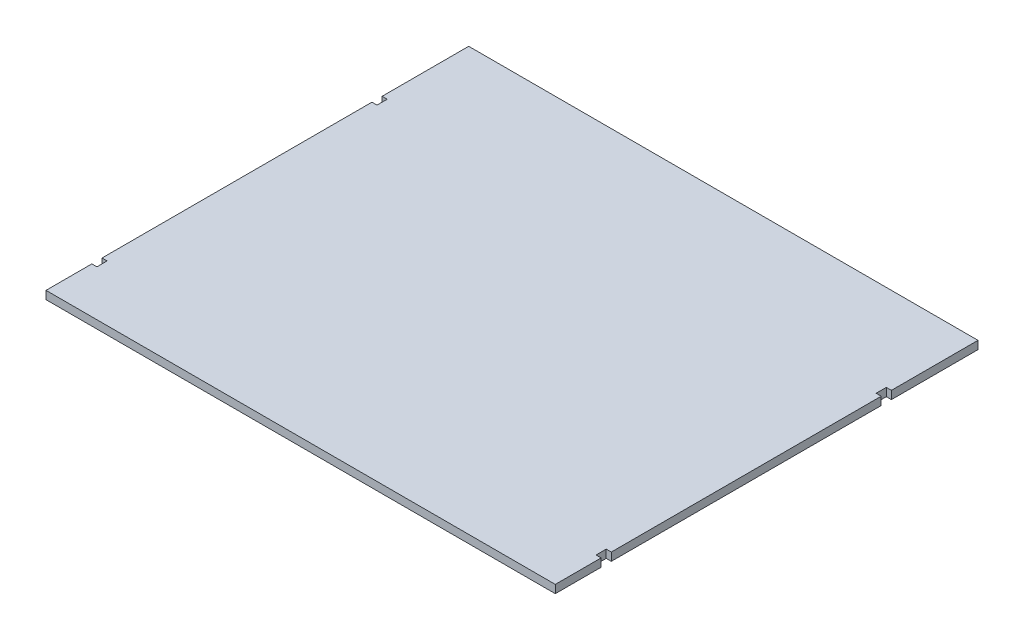
ISO-10303-21;
HEADER;
FILE_DESCRIPTION(('STEP AP214'),'2;1');
FILE_NAME('part.step','',(''),(''),'','','');
FILE_SCHEMA(('AUTOMOTIVE_DESIGN { 1 0 10303 214 1 1 1 1 }'));
ENDSEC;
DATA;
#1=APPLICATION_CONTEXT('core data for automotive mechanical design processes');
#2=APPLICATION_PROTOCOL_DEFINITION('international standard','automotive_design',2000,#1);
#3=PRODUCT_CONTEXT('',#1,'mechanical');
#4=PRODUCT('Part','Part','',(#3));
#5=PRODUCT_RELATED_PRODUCT_CATEGORY('part','',(#4));
#6=PRODUCT_DEFINITION_FORMATION('','',#4);
#7=PRODUCT_DEFINITION_CONTEXT('part definition',#1,'design');
#8=PRODUCT_DEFINITION('design','',#6,#7);
#9=PRODUCT_DEFINITION_SHAPE('','',#8);
#10=(LENGTH_UNIT() NAMED_UNIT(*) SI_UNIT(.MILLI.,.METRE.));
#11=(NAMED_UNIT(*) PLANE_ANGLE_UNIT() SI_UNIT($,.RADIAN.));
#12=(NAMED_UNIT(*) SI_UNIT($,.STERADIAN.) SOLID_ANGLE_UNIT());
#13=UNCERTAINTY_MEASURE_WITH_UNIT(LENGTH_MEASURE(1.E-05),#10,'distance_accuracy_value','');
#14=(GEOMETRIC_REPRESENTATION_CONTEXT(3) GLOBAL_UNCERTAINTY_ASSIGNED_CONTEXT((#13)) GLOBAL_UNIT_ASSIGNED_CONTEXT((#10,
#11,#12)) REPRESENTATION_CONTEXT('',''));
#15=CARTESIAN_POINT('',(0.,0.,0.));
#16=DIRECTION('',(0.,0.,1.));
#17=DIRECTION('',(1.,0.,0.));
#18=AXIS2_PLACEMENT_3D('',#15,#16,#17);
#19=CARTESIAN_POINT('',(0.,1.5875,0.));
#20=DIRECTION('',(1.,0.,0.));
#21=DIRECTION('',(0.,0.,-1.));
#22=AXIS2_PLACEMENT_3D('',#19,#20,#21);
#23=PLANE('',#22);
#24=DIRECTION('',(0.,0.,1.));
#25=VECTOR('',#24,1.);
#26=CARTESIAN_POINT('',(0.,0.,0.));
#27=LINE('',#26,#25);
#28=CARTESIAN_POINT('',(0.,0.,-9.));
#29=VERTEX_POINT('',#28);
#30=CARTESIAN_POINT('',(0.,0.,0.));
#31=VERTEX_POINT('',#30);
#32=EDGE_CURVE('E200',#29,#31,#27,.T.);
#33=ORIENTED_EDGE('',*,*,#32,.T.);
#34=DIRECTION('',(0.,-1.,0.));
#35=VECTOR('',#34,1.);
#36=CARTESIAN_POINT('',(0.,1.5875,0.));
#37=LINE('',#36,#35);
#38=CARTESIAN_POINT('',(0.,1.5875,0.));
#39=VERTEX_POINT('',#38);
#40=EDGE_CURVE('E11',#39,#31,#37,.T.);
#41=ORIENTED_EDGE('',*,*,#40,.F.);
#42=DIRECTION('',(0.,0.,1.));
#43=VECTOR('',#42,1.);
#44=CARTESIAN_POINT('',(0.,1.5875,0.));
#45=LINE('',#44,#43);
#46=CARTESIAN_POINT('',(0.,1.5875,-9.));
#47=VERTEX_POINT('',#46);
#48=EDGE_CURVE('E238',#47,#39,#45,.T.);
#49=ORIENTED_EDGE('',*,*,#48,.F.);
#50=DIRECTION('',(0.,-1.,0.));
#51=VECTOR('',#50,1.);
#52=CARTESIAN_POINT('',(0.,1.5875,-9.));
#53=LINE('',#52,#51);
#54=EDGE_CURVE('E196',#47,#29,#53,.T.);
#55=ORIENTED_EDGE('',*,*,#54,.T.);
#56=EDGE_LOOP('',(#33,#41,#49,#55));
#57=FACE_BOUND('',#56,.T.);
#58=ADVANCED_FACE('F32',(#57),#23,.F.);
#59=CARTESIAN_POINT('',(0.,1.5875,0.));
#60=DIRECTION('',(0.,0.,-1.));
#61=DIRECTION('',(-1.,0.,0.));
#62=AXIS2_PLACEMENT_3D('',#59,#60,#61);
#63=PLANE('',#62);
#64=DIRECTION('',(1.,0.,0.));
#65=VECTOR('',#64,1.);
#66=CARTESIAN_POINT('',(0.,0.,0.));
#67=LINE('',#66,#65);
#68=CARTESIAN_POINT('',(100.,0.,0.));
#69=VERTEX_POINT('',#68);
#70=EDGE_CURVE('E203',#31,#69,#67,.T.);
#71=ORIENTED_EDGE('',*,*,#70,.T.);
#72=DIRECTION('',(0.,-1.,0.));
#73=VECTOR('',#72,1.);
#74=CARTESIAN_POINT('',(100.,1.5875,0.));
#75=LINE('',#74,#73);
#76=CARTESIAN_POINT('',(100.,1.5875,0.));
#77=VERTEX_POINT('',#76);
#78=EDGE_CURVE('E40',#77,#69,#75,.T.);
#79=ORIENTED_EDGE('',*,*,#78,.F.);
#80=DIRECTION('',(1.,0.,0.));
#81=VECTOR('',#80,1.);
#82=CARTESIAN_POINT('',(0.,1.5875,0.));
#83=LINE('',#82,#81);
#84=EDGE_CURVE('E127',#39,#77,#83,.T.);
#85=ORIENTED_EDGE('',*,*,#84,.F.);
#86=ORIENTED_EDGE('',*,*,#40,.T.);
#87=EDGE_LOOP('',(#71,#79,#85,#86));
#88=FACE_BOUND('',#87,.T.);
#89=ADVANCED_FACE('F356',(#88),#63,.F.);
#90=CARTESIAN_POINT('',(100.,1.5875,0.));
#91=DIRECTION('',(-1.,0.,0.));
#92=DIRECTION('',(0.,0.,1.));
#93=AXIS2_PLACEMENT_3D('',#90,#91,#92);
#94=PLANE('',#93);
#95=DIRECTION('',(0.,0.,-1.));
#96=VECTOR('',#95,1.);
#97=CARTESIAN_POINT('',(100.,0.,0.));
#98=LINE('',#97,#96);
#99=CARTESIAN_POINT('',(100.,0.,-9.));
#100=VERTEX_POINT('',#99);
#101=EDGE_CURVE('E205',#69,#100,#98,.T.);
#102=ORIENTED_EDGE('',*,*,#101,.T.);
#103=DIRECTION('',(0.,-1.,0.));
#104=VECTOR('',#103,1.);
#105=CARTESIAN_POINT('',(100.,1.5875,-9.));
#106=LINE('',#105,#104);
#107=CARTESIAN_POINT('',(100.,1.5875,-9.));
#108=VERTEX_POINT('',#107);
#109=EDGE_CURVE('E281',#108,#100,#106,.T.);
#110=ORIENTED_EDGE('',*,*,#109,.F.);
#111=DIRECTION('',(0.,0.,-1.));
#112=VECTOR('',#111,1.);
#113=CARTESIAN_POINT('',(100.,1.5875,0.));
#114=LINE('',#113,#112);
#115=EDGE_CURVE('E289',#77,#108,#114,.T.);
#116=ORIENTED_EDGE('',*,*,#115,.F.);
#117=ORIENTED_EDGE('',*,*,#78,.T.);
#118=EDGE_LOOP('',(#102,#110,#116,#117));
#119=FACE_BOUND('',#118,.T.);
#120=ADVANCED_FACE('F287',(#119),#94,.F.);
#121=CARTESIAN_POINT('',(100.,1.5875,-9.));
#122=DIRECTION('',(0.,0.,1.));
#123=DIRECTION('',(1.,0.,0.));
#124=AXIS2_PLACEMENT_3D('',#121,#122,#123);
#125=PLANE('',#124);
#126=DIRECTION('',(-1.,0.,0.));
#127=VECTOR('',#126,1.);
#128=CARTESIAN_POINT('',(100.,0.,-9.));
#129=LINE('',#128,#127);
#130=CARTESIAN_POINT('',(99.,0.,-9.));
#131=VERTEX_POINT('',#130);
#132=EDGE_CURVE('E207',#100,#131,#129,.T.);
#133=ORIENTED_EDGE('',*,*,#132,.T.);
#134=DIRECTION('',(0.,-1.,0.));
#135=VECTOR('',#134,1.);
#136=CARTESIAN_POINT('',(99.,1.5875,-9.));
#137=LINE('',#136,#135);
#138=CARTESIAN_POINT('',(99.,1.5875,-9.));
#139=VERTEX_POINT('',#138);
#140=EDGE_CURVE('E278',#139,#131,#137,.T.);
#141=ORIENTED_EDGE('',*,*,#140,.F.);
#142=DIRECTION('',(-1.,0.,0.));
#143=VECTOR('',#142,1.);
#144=CARTESIAN_POINT('',(100.,1.5875,-9.));
#145=LINE('',#144,#143);
#146=EDGE_CURVE('E307',#108,#139,#145,.T.);
#147=ORIENTED_EDGE('',*,*,#146,.F.);
#148=ORIENTED_EDGE('',*,*,#109,.T.);
#149=EDGE_LOOP('',(#133,#141,#147,#148));
#150=FACE_BOUND('',#149,.T.);
#151=ADVANCED_FACE('F298',(#150),#125,.F.);
#152=CARTESIAN_POINT('',(99.,1.5875,-9.));
#153=DIRECTION('',(-1.,0.,0.));
#154=DIRECTION('',(0.,0.,1.));
#155=AXIS2_PLACEMENT_3D('',#152,#153,#154);
#156=PLANE('',#155);
#157=DIRECTION('',(0.,0.,-1.));
#158=VECTOR('',#157,1.);
#159=CARTESIAN_POINT('',(99.,0.,-9.));
#160=LINE('',#159,#158);
#161=CARTESIAN_POINT('',(99.,0.,-11.));
#162=VERTEX_POINT('',#161);
#163=EDGE_CURVE('E209',#131,#162,#160,.T.);
#164=ORIENTED_EDGE('',*,*,#163,.T.);
#165=DIRECTION('',(0.,-1.,0.));
#166=VECTOR('',#165,1.);
#167=CARTESIAN_POINT('',(99.,1.5875,-11.));
#168=LINE('',#167,#166);
#169=CARTESIAN_POINT('',(99.,1.5875,-11.));
#170=VERTEX_POINT('',#169);
#171=EDGE_CURVE('E275',#170,#162,#168,.T.);
#172=ORIENTED_EDGE('',*,*,#171,.F.);
#173=DIRECTION('',(0.,0.,-1.));
#174=VECTOR('',#173,1.);
#175=CARTESIAN_POINT('',(99.,1.5875,-9.));
#176=LINE('',#175,#174);
#177=EDGE_CURVE('E304',#139,#170,#176,.T.);
#178=ORIENTED_EDGE('',*,*,#177,.F.);
#179=ORIENTED_EDGE('',*,*,#140,.T.);
#180=EDGE_LOOP('',(#164,#172,#178,#179));
#181=FACE_BOUND('',#180,.T.);
#182=ADVANCED_FACE('F302',(#181),#156,.F.);
#183=CARTESIAN_POINT('',(99.,1.5875,-11.));
#184=DIRECTION('',(0.,0.,-1.));
#185=DIRECTION('',(-1.,0.,0.));
#186=AXIS2_PLACEMENT_3D('',#183,#184,#185);
#187=PLANE('',#186);
#188=DIRECTION('',(1.,0.,0.));
#189=VECTOR('',#188,1.);
#190=CARTESIAN_POINT('',(99.,0.,-11.));
#191=LINE('',#190,#189);
#192=CARTESIAN_POINT('',(100.,0.,-11.));
#193=VERTEX_POINT('',#192);
#194=EDGE_CURVE('E211',#162,#193,#191,.T.);
#195=ORIENTED_EDGE('',*,*,#194,.T.);
#196=DIRECTION('',(0.,-1.,0.));
#197=VECTOR('',#196,1.);
#198=CARTESIAN_POINT('',(100.,1.5875,-11.));
#199=LINE('',#198,#197);
#200=CARTESIAN_POINT('',(100.,1.5875,-11.));
#201=VERTEX_POINT('',#200);
#202=EDGE_CURVE('E272',#201,#193,#199,.T.);
#203=ORIENTED_EDGE('',*,*,#202,.F.);
#204=DIRECTION('',(1.,0.,0.));
#205=VECTOR('',#204,1.);
#206=CARTESIAN_POINT('',(99.,1.5875,-11.));
#207=LINE('',#206,#205);
#208=EDGE_CURVE('E306',#170,#201,#207,.T.);
#209=ORIENTED_EDGE('',*,*,#208,.F.);
#210=ORIENTED_EDGE('',*,*,#171,.T.);
#211=EDGE_LOOP('',(#195,#203,#209,#210));
#212=FACE_BOUND('',#211,.T.);
#213=ADVANCED_FACE('F369',(#212),#187,.F.);
#214=CARTESIAN_POINT('',(100.,1.5875,-11.));
#215=DIRECTION('',(-1.,0.,0.));
#216=DIRECTION('',(0.,0.,1.));
#217=AXIS2_PLACEMENT_3D('',#214,#215,#216);
#218=PLANE('',#217);
#219=DIRECTION('',(0.,0.,-1.));
#220=VECTOR('',#219,1.);
#221=CARTESIAN_POINT('',(100.,0.,-11.));
#222=LINE('',#221,#220);
#223=CARTESIAN_POINT('',(100.,0.,-64.));
#224=VERTEX_POINT('',#223);
#225=EDGE_CURVE('E213',#193,#224,#222,.T.);
#226=ORIENTED_EDGE('',*,*,#225,.T.);
#227=DIRECTION('',(0.,-1.,0.));
#228=VECTOR('',#227,1.);
#229=CARTESIAN_POINT('',(100.,1.5875,-64.));
#230=LINE('',#229,#228);
#231=CARTESIAN_POINT('',(100.,1.5875,-64.));
#232=VERTEX_POINT('',#231);
#233=EDGE_CURVE('E269',#232,#224,#230,.T.);
#234=ORIENTED_EDGE('',*,*,#233,.F.);
#235=DIRECTION('',(0.,0.,-1.));
#236=VECTOR('',#235,1.);
#237=CARTESIAN_POINT('',(100.,1.5875,-11.));
#238=LINE('',#237,#236);
#239=EDGE_CURVE('E309',#201,#232,#238,.T.);
#240=ORIENTED_EDGE('',*,*,#239,.F.);
#241=ORIENTED_EDGE('',*,*,#202,.T.);
#242=EDGE_LOOP('',(#226,#234,#240,#241));
#243=FACE_BOUND('',#242,.T.);
#244=ADVANCED_FACE('F372',(#243),#218,.F.);
#245=CARTESIAN_POINT('',(99.,1.5875,-64.));
#246=DIRECTION('',(0.,0.,1.));
#247=DIRECTION('',(1.,0.,0.));
#248=AXIS2_PLACEMENT_3D('',#245,#246,#247);
#249=PLANE('',#248);
#250=DIRECTION('',(-1.,0.,0.));
#251=VECTOR('',#250,1.);
#252=CARTESIAN_POINT('',(99.,0.,-64.));
#253=LINE('',#252,#251);
#254=CARTESIAN_POINT('',(99.,0.,-64.));
#255=VERTEX_POINT('',#254);
#256=EDGE_CURVE('E215',#224,#255,#253,.T.);
#257=ORIENTED_EDGE('',*,*,#256,.T.);
#258=DIRECTION('',(0.,-1.,0.));
#259=VECTOR('',#258,1.);
#260=CARTESIAN_POINT('',(99.,1.5875,-64.));
#261=LINE('',#260,#259);
#262=CARTESIAN_POINT('',(99.,1.5875,-64.));
#263=VERTEX_POINT('',#262);
#264=EDGE_CURVE('E266',#263,#255,#261,.T.);
#265=ORIENTED_EDGE('',*,*,#264,.F.);
#266=DIRECTION('',(-1.,0.,0.));
#267=VECTOR('',#266,1.);
#268=CARTESIAN_POINT('',(99.,1.5875,-64.));
#269=LINE('',#268,#267);
#270=EDGE_CURVE('E315',#232,#263,#269,.T.);
#271=ORIENTED_EDGE('',*,*,#270,.F.);
#272=ORIENTED_EDGE('',*,*,#233,.T.);
#273=EDGE_LOOP('',(#257,#265,#271,#272));
#274=FACE_BOUND('',#273,.T.);
#275=ADVANCED_FACE('F376',(#274),#249,.F.);
#276=CARTESIAN_POINT('',(99.,1.5875,-66.));
#277=DIRECTION('',(-1.,0.,0.));
#278=DIRECTION('',(0.,0.,1.));
#279=AXIS2_PLACEMENT_3D('',#276,#277,#278);
#280=PLANE('',#279);
#281=DIRECTION('',(0.,0.,-1.));
#282=VECTOR('',#281,1.);
#283=CARTESIAN_POINT('',(99.,0.,-66.));
#284=LINE('',#283,#282);
#285=CARTESIAN_POINT('',(99.,0.,-66.));
#286=VERTEX_POINT('',#285);
#287=EDGE_CURVE('E217',#255,#286,#284,.T.);
#288=ORIENTED_EDGE('',*,*,#287,.T.);
#289=DIRECTION('',(0.,-1.,0.));
#290=VECTOR('',#289,1.);
#291=CARTESIAN_POINT('',(99.,1.5875,-66.));
#292=LINE('',#291,#290);
#293=CARTESIAN_POINT('',(99.,1.5875,-66.));
#294=VERTEX_POINT('',#293);
#295=EDGE_CURVE('E263',#294,#286,#292,.T.);
#296=ORIENTED_EDGE('',*,*,#295,.F.);
#297=DIRECTION('',(0.,0.,-1.));
#298=VECTOR('',#297,1.);
#299=CARTESIAN_POINT('',(99.,1.5875,-66.));
#300=LINE('',#299,#298);
#301=EDGE_CURVE('E317',#263,#294,#300,.T.);
#302=ORIENTED_EDGE('',*,*,#301,.F.);
#303=ORIENTED_EDGE('',*,*,#264,.T.);
#304=EDGE_LOOP('',(#288,#296,#302,#303));
#305=FACE_BOUND('',#304,.T.);
#306=ADVANCED_FACE('F380',(#305),#280,.F.);
#307=CARTESIAN_POINT('',(100.,1.5875,-66.));
#308=DIRECTION('',(0.,0.,-1.));
#309=DIRECTION('',(-1.,0.,0.));
#310=AXIS2_PLACEMENT_3D('',#307,#308,#309);
#311=PLANE('',#310);
#312=DIRECTION('',(1.,0.,0.));
#313=VECTOR('',#312,1.);
#314=CARTESIAN_POINT('',(100.,0.,-66.));
#315=LINE('',#314,#313);
#316=CARTESIAN_POINT('',(100.,0.,-66.));
#317=VERTEX_POINT('',#316);
#318=EDGE_CURVE('E219',#286,#317,#315,.T.);
#319=ORIENTED_EDGE('',*,*,#318,.T.);
#320=DIRECTION('',(0.,-1.,0.));
#321=VECTOR('',#320,1.);
#322=CARTESIAN_POINT('',(100.,1.5875,-66.));
#323=LINE('',#322,#321);
#324=CARTESIAN_POINT('',(100.,1.5875,-66.));
#325=VERTEX_POINT('',#324);
#326=EDGE_CURVE('E260',#325,#317,#323,.T.);
#327=ORIENTED_EDGE('',*,*,#326,.F.);
#328=DIRECTION('',(1.,0.,0.));
#329=VECTOR('',#328,1.);
#330=CARTESIAN_POINT('',(100.,1.5875,-66.));
#331=LINE('',#330,#329);
#332=EDGE_CURVE('E319',#294,#325,#331,.T.);
#333=ORIENTED_EDGE('',*,*,#332,.F.);
#334=ORIENTED_EDGE('',*,*,#295,.T.);
#335=EDGE_LOOP('',(#319,#327,#333,#334));
#336=FACE_BOUND('',#335,.T.);
#337=ADVANCED_FACE('F384',(#336),#311,.F.);
#338=CARTESIAN_POINT('',(100.,1.5875,-66.));
#339=DIRECTION('',(-1.,0.,0.));
#340=DIRECTION('',(0.,0.,1.));
#341=AXIS2_PLACEMENT_3D('',#338,#339,#340);
#342=PLANE('',#341);
#343=DIRECTION('',(0.,0.,-1.));
#344=VECTOR('',#343,1.);
#345=CARTESIAN_POINT('',(100.,0.,-66.));
#346=LINE('',#345,#344);
#347=CARTESIAN_POINT('',(100.,0.,-83.));
#348=VERTEX_POINT('',#347);
#349=EDGE_CURVE('E221',#317,#348,#346,.T.);
#350=ORIENTED_EDGE('',*,*,#349,.T.);
#351=DIRECTION('',(0.,-1.,0.));
#352=VECTOR('',#351,1.);
#353=CARTESIAN_POINT('',(100.,1.5875,-83.));
#354=LINE('',#353,#352);
#355=CARTESIAN_POINT('',(100.,1.5875,-83.));
#356=VERTEX_POINT('',#355);
#357=EDGE_CURVE('E257',#356,#348,#354,.T.);
#358=ORIENTED_EDGE('',*,*,#357,.F.);
#359=DIRECTION('',(0.,0.,-1.));
#360=VECTOR('',#359,1.);
#361=CARTESIAN_POINT('',(100.,1.5875,-66.));
#362=LINE('',#361,#360);
#363=EDGE_CURVE('E321',#325,#356,#362,.T.);
#364=ORIENTED_EDGE('',*,*,#363,.F.);
#365=ORIENTED_EDGE('',*,*,#326,.T.);
#366=EDGE_LOOP('',(#350,#358,#364,#365));
#367=FACE_BOUND('',#366,.T.);
#368=ADVANCED_FACE('F388',(#367),#342,.F.);
#369=CARTESIAN_POINT('',(0.,1.5875,-83.));
#370=DIRECTION('',(0.,0.,1.));
#371=DIRECTION('',(1.,0.,0.));
#372=AXIS2_PLACEMENT_3D('',#369,#370,#371);
#373=PLANE('',#372);
#374=DIRECTION('',(-1.,0.,0.));
#375=VECTOR('',#374,1.);
#376=CARTESIAN_POINT('',(0.,0.,-83.));
#377=LINE('',#376,#375);
#378=CARTESIAN_POINT('',(0.,0.,-83.));
#379=VERTEX_POINT('',#378);
#380=EDGE_CURVE('E223',#348,#379,#377,.T.);
#381=ORIENTED_EDGE('',*,*,#380,.T.);
#382=DIRECTION('',(0.,-1.,0.));
#383=VECTOR('',#382,1.);
#384=CARTESIAN_POINT('',(0.,1.5875,-83.));
#385=LINE('',#384,#383);
#386=CARTESIAN_POINT('',(0.,1.5875,-83.));
#387=VERTEX_POINT('',#386);
#388=EDGE_CURVE('E254',#387,#379,#385,.T.);
#389=ORIENTED_EDGE('',*,*,#388,.F.);
#390=DIRECTION('',(-1.,0.,0.));
#391=VECTOR('',#390,1.);
#392=CARTESIAN_POINT('',(0.,1.5875,-83.));
#393=LINE('',#392,#391);
#394=EDGE_CURVE('E323',#356,#387,#393,.T.);
#395=ORIENTED_EDGE('',*,*,#394,.F.);
#396=ORIENTED_EDGE('',*,*,#357,.T.);
#397=EDGE_LOOP('',(#381,#389,#395,#396));
#398=FACE_BOUND('',#397,.T.);
#399=ADVANCED_FACE('F392',(#398),#373,.F.);
#400=CARTESIAN_POINT('',(0.,1.5875,-66.));
#401=DIRECTION('',(1.,0.,0.));
#402=DIRECTION('',(0.,0.,-1.));
#403=AXIS2_PLACEMENT_3D('',#400,#401,#402);
#404=PLANE('',#403);
#405=DIRECTION('',(0.,0.,1.));
#406=VECTOR('',#405,1.);
#407=CARTESIAN_POINT('',(0.,0.,-66.));
#408=LINE('',#407,#406);
#409=CARTESIAN_POINT('',(0.,0.,-66.));
#410=VERTEX_POINT('',#409);
#411=EDGE_CURVE('E225',#379,#410,#408,.T.);
#412=ORIENTED_EDGE('',*,*,#411,.T.);
#413=DIRECTION('',(0.,-1.,0.));
#414=VECTOR('',#413,1.);
#415=CARTESIAN_POINT('',(0.,1.5875,-66.));
#416=LINE('',#415,#414);
#417=CARTESIAN_POINT('',(0.,1.5875,-66.));
#418=VERTEX_POINT('',#417);
#419=EDGE_CURVE('E251',#418,#410,#416,.T.);
#420=ORIENTED_EDGE('',*,*,#419,.F.);
#421=DIRECTION('',(0.,0.,1.));
#422=VECTOR('',#421,1.);
#423=CARTESIAN_POINT('',(0.,1.5875,-66.));
#424=LINE('',#423,#422);
#425=EDGE_CURVE('E325',#387,#418,#424,.T.);
#426=ORIENTED_EDGE('',*,*,#425,.F.);
#427=ORIENTED_EDGE('',*,*,#388,.T.);
#428=EDGE_LOOP('',(#412,#420,#426,#427));
#429=FACE_BOUND('',#428,.T.);
#430=ADVANCED_FACE('F396',(#429),#404,.F.);
#431=CARTESIAN_POINT('',(1.,1.5875,-66.));
#432=DIRECTION('',(0.,0.,-1.));
#433=DIRECTION('',(-1.,0.,0.));
#434=AXIS2_PLACEMENT_3D('',#431,#432,#433);
#435=PLANE('',#434);
#436=DIRECTION('',(1.,0.,0.));
#437=VECTOR('',#436,1.);
#438=CARTESIAN_POINT('',(1.,0.,-66.));
#439=LINE('',#438,#437);
#440=CARTESIAN_POINT('',(1.,0.,-66.));
#441=VERTEX_POINT('',#440);
#442=EDGE_CURVE('E227',#410,#441,#439,.T.);
#443=ORIENTED_EDGE('',*,*,#442,.T.);
#444=DIRECTION('',(0.,-1.,0.));
#445=VECTOR('',#444,1.);
#446=CARTESIAN_POINT('',(1.,1.5875,-66.));
#447=LINE('',#446,#445);
#448=CARTESIAN_POINT('',(1.,1.5875,-66.));
#449=VERTEX_POINT('',#448);
#450=EDGE_CURVE('E248',#449,#441,#447,.T.);
#451=ORIENTED_EDGE('',*,*,#450,.F.);
#452=DIRECTION('',(1.,0.,0.));
#453=VECTOR('',#452,1.);
#454=CARTESIAN_POINT('',(1.,1.5875,-66.));
#455=LINE('',#454,#453);
#456=EDGE_CURVE('E327',#418,#449,#455,.T.);
#457=ORIENTED_EDGE('',*,*,#456,.F.);
#458=ORIENTED_EDGE('',*,*,#419,.T.);
#459=EDGE_LOOP('',(#443,#451,#457,#458));
#460=FACE_BOUND('',#459,.T.);
#461=ADVANCED_FACE('F400',(#460),#435,.F.);
#462=CARTESIAN_POINT('',(1.,1.5875,-64.));
#463=DIRECTION('',(1.,0.,0.));
#464=DIRECTION('',(0.,0.,-1.));
#465=AXIS2_PLACEMENT_3D('',#462,#463,#464);
#466=PLANE('',#465);
#467=DIRECTION('',(0.,0.,1.));
#468=VECTOR('',#467,1.);
#469=CARTESIAN_POINT('',(1.,0.,-64.));
#470=LINE('',#469,#468);
#471=CARTESIAN_POINT('',(1.,0.,-64.));
#472=VERTEX_POINT('',#471);
#473=EDGE_CURVE('E229',#441,#472,#470,.T.);
#474=ORIENTED_EDGE('',*,*,#473,.T.);
#475=DIRECTION('',(0.,-1.,0.));
#476=VECTOR('',#475,1.);
#477=CARTESIAN_POINT('',(1.,1.5875,-64.));
#478=LINE('',#477,#476);
#479=CARTESIAN_POINT('',(1.,1.5875,-64.));
#480=VERTEX_POINT('',#479);
#481=EDGE_CURVE('E245',#480,#472,#478,.T.);
#482=ORIENTED_EDGE('',*,*,#481,.F.);
#483=DIRECTION('',(0.,0.,1.));
#484=VECTOR('',#483,1.);
#485=CARTESIAN_POINT('',(1.,1.5875,-64.));
#486=LINE('',#485,#484);
#487=EDGE_CURVE('E329',#449,#480,#486,.T.);
#488=ORIENTED_EDGE('',*,*,#487,.F.);
#489=ORIENTED_EDGE('',*,*,#450,.T.);
#490=EDGE_LOOP('',(#474,#482,#488,#489));
#491=FACE_BOUND('',#490,.T.);
#492=ADVANCED_FACE('F404',(#491),#466,.F.);
#493=CARTESIAN_POINT('',(0.,1.5875,-64.));
#494=DIRECTION('',(0.,0.,1.));
#495=DIRECTION('',(1.,0.,0.));
#496=AXIS2_PLACEMENT_3D('',#493,#494,#495);
#497=PLANE('',#496);
#498=DIRECTION('',(-1.,0.,0.));
#499=VECTOR('',#498,1.);
#500=CARTESIAN_POINT('',(0.,0.,-64.));
#501=LINE('',#500,#499);
#502=CARTESIAN_POINT('',(0.,0.,-64.));
#503=VERTEX_POINT('',#502);
#504=EDGE_CURVE('E231',#472,#503,#501,.T.);
#505=ORIENTED_EDGE('',*,*,#504,.T.);
#506=DIRECTION('',(0.,-1.,0.));
#507=VECTOR('',#506,1.);
#508=CARTESIAN_POINT('',(0.,1.5875,-64.));
#509=LINE('',#508,#507);
#510=CARTESIAN_POINT('',(0.,1.5875,-64.));
#511=VERTEX_POINT('',#510);
#512=EDGE_CURVE('E242',#511,#503,#509,.T.);
#513=ORIENTED_EDGE('',*,*,#512,.F.);
#514=DIRECTION('',(-1.,0.,0.));
#515=VECTOR('',#514,1.);
#516=CARTESIAN_POINT('',(0.,1.5875,-64.));
#517=LINE('',#516,#515);
#518=EDGE_CURVE('E331',#480,#511,#517,.T.);
#519=ORIENTED_EDGE('',*,*,#518,.F.);
#520=ORIENTED_EDGE('',*,*,#481,.T.);
#521=EDGE_LOOP('',(#505,#513,#519,#520));
#522=FACE_BOUND('',#521,.T.);
#523=ADVANCED_FACE('F337',(#522),#497,.F.);
#524=CARTESIAN_POINT('',(0.,1.5875,-11.));
#525=DIRECTION('',(1.,0.,0.));
#526=DIRECTION('',(0.,0.,-1.));
#527=AXIS2_PLACEMENT_3D('',#524,#525,#526);
#528=PLANE('',#527);
#529=DIRECTION('',(0.,0.,1.));
#530=VECTOR('',#529,1.);
#531=CARTESIAN_POINT('',(0.,0.,-11.));
#532=LINE('',#531,#530);
#533=CARTESIAN_POINT('',(0.,0.,-11.));
#534=VERTEX_POINT('',#533);
#535=EDGE_CURVE('E233',#503,#534,#532,.T.);
#536=ORIENTED_EDGE('',*,*,#535,.T.);
#537=DIRECTION('',(0.,-1.,0.));
#538=VECTOR('',#537,1.);
#539=CARTESIAN_POINT('',(0.,1.5875,-11.));
#540=LINE('',#539,#538);
#541=CARTESIAN_POINT('',(0.,1.5875,-11.));
#542=VERTEX_POINT('',#541);
#543=EDGE_CURVE('E191',#542,#534,#540,.T.);
#544=ORIENTED_EDGE('',*,*,#543,.F.);
#545=DIRECTION('',(0.,0.,1.));
#546=VECTOR('',#545,1.);
#547=CARTESIAN_POINT('',(0.,1.5875,-11.));
#548=LINE('',#547,#546);
#549=EDGE_CURVE('E182',#511,#542,#548,.T.);
#550=ORIENTED_EDGE('',*,*,#549,.F.);
#551=ORIENTED_EDGE('',*,*,#512,.T.);
#552=EDGE_LOOP('',(#536,#544,#550,#551));
#553=FACE_BOUND('',#552,.T.);
#554=ADVANCED_FACE('F341',(#553),#528,.F.);
#555=CARTESIAN_POINT('',(1.,1.5875,-11.));
#556=DIRECTION('',(0.,0.,-1.));
#557=DIRECTION('',(-1.,0.,0.));
#558=AXIS2_PLACEMENT_3D('',#555,#556,#557);
#559=PLANE('',#558);
#560=DIRECTION('',(1.,0.,0.));
#561=VECTOR('',#560,1.);
#562=CARTESIAN_POINT('',(1.,0.,-11.));
#563=LINE('',#562,#561);
#564=CARTESIAN_POINT('',(1.,0.,-11.));
#565=VERTEX_POINT('',#564);
#566=EDGE_CURVE('E190',#534,#565,#563,.T.);
#567=ORIENTED_EDGE('',*,*,#566,.T.);
#568=DIRECTION('',(0.,-1.,0.));
#569=VECTOR('',#568,1.);
#570=CARTESIAN_POINT('',(1.,1.5875,-11.));
#571=LINE('',#570,#569);
#572=CARTESIAN_POINT('',(1.,1.5875,-11.));
#573=VERTEX_POINT('',#572);
#574=EDGE_CURVE('E187',#573,#565,#571,.T.);
#575=ORIENTED_EDGE('',*,*,#574,.F.);
#576=DIRECTION('',(1.,0.,0.));
#577=VECTOR('',#576,1.);
#578=CARTESIAN_POINT('',(1.,1.5875,-11.));
#579=LINE('',#578,#577);
#580=EDGE_CURVE('E176',#542,#573,#579,.T.);
#581=ORIENTED_EDGE('',*,*,#580,.F.);
#582=ORIENTED_EDGE('',*,*,#543,.T.);
#583=EDGE_LOOP('',(#567,#575,#581,#582));
#584=FACE_BOUND('',#583,.T.);
#585=ADVANCED_FACE('F188',(#584),#559,.F.);
#586=CARTESIAN_POINT('',(1.,1.5875,-9.));
#587=DIRECTION('',(1.,0.,0.));
#588=DIRECTION('',(0.,0.,-1.));
#589=AXIS2_PLACEMENT_3D('',#586,#587,#588);
#590=PLANE('',#589);
#591=DIRECTION('',(0.,0.,1.));
#592=VECTOR('',#591,1.);
#593=CARTESIAN_POINT('',(1.,0.,-9.));
#594=LINE('',#593,#592);
#595=CARTESIAN_POINT('',(1.,0.,-9.));
#596=VERTEX_POINT('',#595);
#597=EDGE_CURVE('E113',#565,#596,#594,.T.);
#598=ORIENTED_EDGE('',*,*,#597,.T.);
#599=DIRECTION('',(0.,-1.,0.));
#600=VECTOR('',#599,1.);
#601=CARTESIAN_POINT('',(1.,1.5875,-9.));
#602=LINE('',#601,#600);
#603=CARTESIAN_POINT('',(1.,1.5875,-9.));
#604=VERTEX_POINT('',#603);
#605=EDGE_CURVE('E192',#604,#596,#602,.T.);
#606=ORIENTED_EDGE('',*,*,#605,.F.);
#607=DIRECTION('',(0.,0.,1.));
#608=VECTOR('',#607,1.);
#609=CARTESIAN_POINT('',(1.,1.5875,-9.));
#610=LINE('',#609,#608);
#611=EDGE_CURVE('E180',#573,#604,#610,.T.);
#612=ORIENTED_EDGE('',*,*,#611,.F.);
#613=ORIENTED_EDGE('',*,*,#574,.T.);
#614=EDGE_LOOP('',(#598,#606,#612,#613));
#615=FACE_BOUND('',#614,.T.);
#616=ADVANCED_FACE('F194',(#615),#590,.F.);
#617=CARTESIAN_POINT('',(0.,1.5875,-9.));
#618=DIRECTION('',(0.,0.,1.));
#619=DIRECTION('',(1.,0.,0.));
#620=AXIS2_PLACEMENT_3D('',#617,#618,#619);
#621=PLANE('',#620);
#622=DIRECTION('',(-1.,0.,0.));
#623=VECTOR('',#622,1.);
#624=CARTESIAN_POINT('',(0.,0.,-9.));
#625=LINE('',#624,#623);
#626=EDGE_CURVE('E119',#596,#29,#625,.T.);
#627=ORIENTED_EDGE('',*,*,#626,.T.);
#628=ORIENTED_EDGE('',*,*,#54,.F.);
#629=DIRECTION('',(-1.,0.,0.));
#630=VECTOR('',#629,1.);
#631=CARTESIAN_POINT('',(0.,1.5875,-9.));
#632=LINE('',#631,#630);
#633=EDGE_CURVE('E48',#604,#47,#632,.T.);
#634=ORIENTED_EDGE('',*,*,#633,.F.);
#635=ORIENTED_EDGE('',*,*,#605,.T.);
#636=EDGE_LOOP('',(#627,#628,#634,#635));
#637=FACE_BOUND('',#636,.T.);
#638=ADVANCED_FACE('F345',(#637),#621,.F.);
#639=CARTESIAN_POINT('',(0.,1.5875,-9.));
#640=DIRECTION('',(0.,-1.,0.));
#641=DIRECTION('',(0.,0.,-1.));
#642=AXIS2_PLACEMENT_3D('',#639,#640,#641);
#643=PLANE('',#642);
#644=ORIENTED_EDGE('',*,*,#48,.T.);
#645=ORIENTED_EDGE('',*,*,#84,.T.);
#646=ORIENTED_EDGE('',*,*,#115,.T.);
#647=ORIENTED_EDGE('',*,*,#146,.T.);
#648=ORIENTED_EDGE('',*,*,#177,.T.);
#649=ORIENTED_EDGE('',*,*,#208,.T.);
#650=ORIENTED_EDGE('',*,*,#239,.T.);
#651=ORIENTED_EDGE('',*,*,#270,.T.);
#652=ORIENTED_EDGE('',*,*,#301,.T.);
#653=ORIENTED_EDGE('',*,*,#332,.T.);
#654=ORIENTED_EDGE('',*,*,#363,.T.);
#655=ORIENTED_EDGE('',*,*,#394,.T.);
#656=ORIENTED_EDGE('',*,*,#425,.T.);
#657=ORIENTED_EDGE('',*,*,#456,.T.);
#658=ORIENTED_EDGE('',*,*,#487,.T.);
#659=ORIENTED_EDGE('',*,*,#518,.T.);
#660=ORIENTED_EDGE('',*,*,#549,.T.);
#661=ORIENTED_EDGE('',*,*,#580,.T.);
#662=ORIENTED_EDGE('',*,*,#611,.T.);
#663=ORIENTED_EDGE('',*,*,#633,.T.);
#664=EDGE_LOOP('',(#644,#645,#646,#647,#648,#649,#650,#651,#652,#653,#654,#655,#656,#657,#658,
#659,#660,#661,#662,#663));
#665=FACE_BOUND('',#664,.T.);
#666=ADVANCED_FACE('F178',(#665),#643,.F.);
#667=CARTESIAN_POINT('',(0.,0.,-9.));
#668=DIRECTION('',(0.,-1.,0.));
#669=DIRECTION('',(0.,0.,-1.));
#670=AXIS2_PLACEMENT_3D('',#667,#668,#669);
#671=PLANE('',#670);
#672=ORIENTED_EDGE('',*,*,#32,.F.);
#673=ORIENTED_EDGE('',*,*,#626,.F.);
#674=ORIENTED_EDGE('',*,*,#597,.F.);
#675=ORIENTED_EDGE('',*,*,#566,.F.);
#676=ORIENTED_EDGE('',*,*,#535,.F.);
#677=ORIENTED_EDGE('',*,*,#504,.F.);
#678=ORIENTED_EDGE('',*,*,#473,.F.);
#679=ORIENTED_EDGE('',*,*,#442,.F.);
#680=ORIENTED_EDGE('',*,*,#411,.F.);
#681=ORIENTED_EDGE('',*,*,#380,.F.);
#682=ORIENTED_EDGE('',*,*,#349,.F.);
#683=ORIENTED_EDGE('',*,*,#318,.F.);
#684=ORIENTED_EDGE('',*,*,#287,.F.);
#685=ORIENTED_EDGE('',*,*,#256,.F.);
#686=ORIENTED_EDGE('',*,*,#225,.F.);
#687=ORIENTED_EDGE('',*,*,#194,.F.);
#688=ORIENTED_EDGE('',*,*,#163,.F.);
#689=ORIENTED_EDGE('',*,*,#132,.F.);
#690=ORIENTED_EDGE('',*,*,#101,.F.);
#691=ORIENTED_EDGE('',*,*,#70,.F.);
#692=EDGE_LOOP('',(#672,#673,#674,#675,#676,#677,#678,#679,#680,#681,#682,#683,#684,#685,#686,
#687,#688,#689,#690,#691));
#693=FACE_BOUND('',#692,.T.);
#694=ADVANCED_FACE('F293',(#693),#671,.T.);
#695=CLOSED_SHELL('',(#58,#89,#120,#151,#182,#213,#244,#275,#306,#337,#368,#399,#430,#461,#492,
#523,#554,#585,#616,#638,#666,#694));
#696=MANIFOLD_SOLID_BREP('B2',#695);
#697=ADVANCED_BREP_SHAPE_REPRESENTATION('',(#18,#696),#14);
#698=SHAPE_DEFINITION_REPRESENTATION(#9,#697);
ENDSEC;
END-ISO-10303-21;
